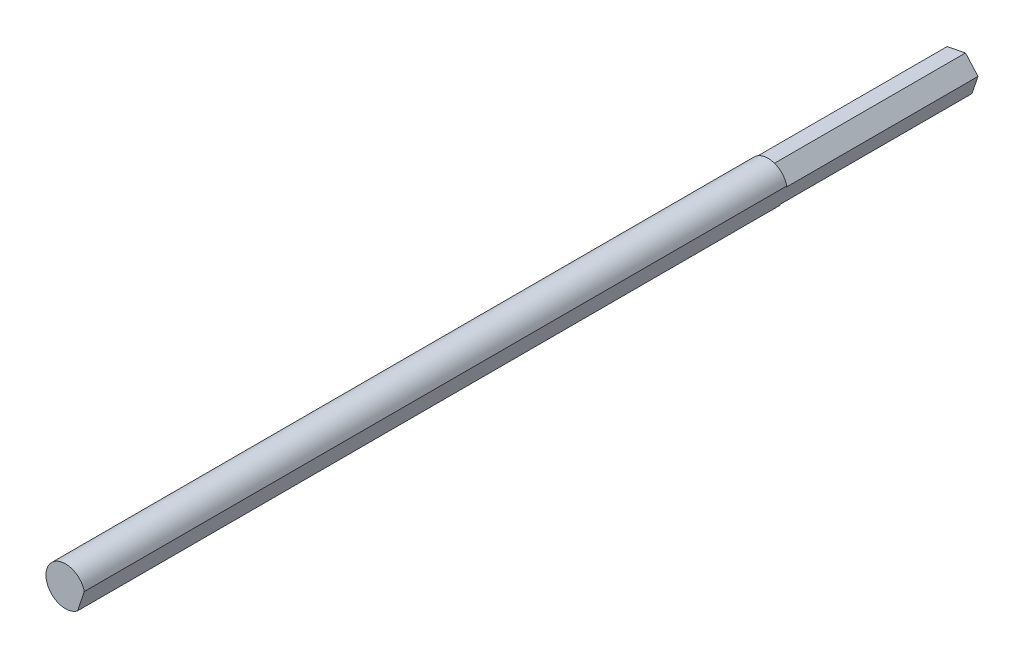
ISO-10303-21;
HEADER;
FILE_DESCRIPTION(('STEP AP214'),'2;1');
FILE_NAME('part.step','',(''),(''),'','','');
FILE_SCHEMA(('AUTOMOTIVE_DESIGN { 1 0 10303 214 1 1 1 1 }'));
ENDSEC;
DATA;
#1=APPLICATION_CONTEXT('core data for automotive mechanical design processes');
#2=APPLICATION_PROTOCOL_DEFINITION('international standard','automotive_design',2000,#1);
#3=PRODUCT_CONTEXT('',#1,'mechanical');
#4=PRODUCT('Part','Part','',(#3));
#5=PRODUCT_RELATED_PRODUCT_CATEGORY('part','',(#4));
#6=PRODUCT_DEFINITION_FORMATION('','',#4);
#7=PRODUCT_DEFINITION_CONTEXT('part definition',#1,'design');
#8=PRODUCT_DEFINITION('design','',#6,#7);
#9=PRODUCT_DEFINITION_SHAPE('','',#8);
#10=(LENGTH_UNIT() NAMED_UNIT(*) SI_UNIT(.MILLI.,.METRE.));
#11=(NAMED_UNIT(*) PLANE_ANGLE_UNIT() SI_UNIT($,.RADIAN.));
#12=(NAMED_UNIT(*) SI_UNIT($,.STERADIAN.) SOLID_ANGLE_UNIT());
#13=UNCERTAINTY_MEASURE_WITH_UNIT(LENGTH_MEASURE(1.E-05),#10,'distance_accuracy_value','');
#14=(GEOMETRIC_REPRESENTATION_CONTEXT(3) GLOBAL_UNCERTAINTY_ASSIGNED_CONTEXT((#13)) GLOBAL_UNIT_ASSIGNED_CONTEXT((#10,
#11,#12)) REPRESENTATION_CONTEXT('',''));
#15=CARTESIAN_POINT('',(0.,0.,0.));
#16=DIRECTION('',(0.,0.,1.));
#17=DIRECTION('',(1.,0.,0.));
#18=AXIS2_PLACEMENT_3D('',#15,#16,#17);
#19=CARTESIAN_POINT('',(0.,0.,-110.));
#20=DIRECTION('',(0.,0.,1.));
#21=DIRECTION('',(1.,0.,0.));
#22=AXIS2_PLACEMENT_3D('',#19,#20,#21);
#23=PLANE('',#22);
#24=DIRECTION('',(0.317894292419729,0.948126161882985,0.));
#25=VECTOR('',#24,1.);
#26=CARTESIAN_POINT('',(2.42224895944074,-0.812148372213014,-110.));
#27=LINE('',#26,#25);
#28=CARTESIAN_POINT('',(1.89263048526532,-2.39174619185322,-110.));
#29=VERTEX_POINT('',#28);
#30=CARTESIAN_POINT('',(1.95335487812164,-2.21063446099041,-110.));
#31=VERTEX_POINT('',#30);
#32=EDGE_CURVE('E99',#29,#31,#27,.T.);
#33=ORIENTED_EDGE('',*,*,#32,.F.);
#34=CARTESIAN_POINT('',(0.,0.,-110.));
#35=DIRECTION('',(0.,0.,1.));
#36=DIRECTION('',(1.,0.,0.));
#37=AXIS2_PLACEMENT_3D('',#34,#35,#36);
#38=CIRCLE('',#37,3.05);
#39=CARTESIAN_POINT('',(2.95186743361617,0.76744944742719,-110.));
#40=VERTEX_POINT('',#39);
#41=EDGE_CURVE('E11',#40,#29,#38,.T.);
#42=ORIENTED_EDGE('',*,*,#41,.F.);
#43=CARTESIAN_POINT('',(2.89114304075984,0.586337716564391,-110.));
#44=VERTEX_POINT('',#43);
#45=EDGE_CURVE('E111',#44,#40,#27,.T.);
#46=ORIENTED_EDGE('',*,*,#45,.F.);
#47=DIRECTION('',(0.662154195973439,-0.749367613895056,0.));
#48=VECTOR('',#47,1.);
#49=CARTESIAN_POINT('',(0.937788162638196,2.79697217755481,-110.));
#50=LINE('',#49,#48);
#51=CARTESIAN_POINT('',(0.937788162638196,2.79697217755481,-110.));
#52=VERTEX_POINT('',#51);
#53=EDGE_CURVE('E118',#52,#44,#50,.T.);
#54=ORIENTED_EDGE('',*,*,#53,.F.);
#55=DIRECTION('',(0.980048488393166,0.19875854798793,0.));
#56=VECTOR('',#55,1.);
#57=CARTESIAN_POINT('',(-1.95335487812164,2.21063446099041,-110.));
#58=LINE('',#57,#56);
#59=CARTESIAN_POINT('',(-1.95335487812164,2.21063446099041,-110.));
#60=VERTEX_POINT('',#59);
#61=EDGE_CURVE('E161',#60,#52,#58,.T.);
#62=ORIENTED_EDGE('',*,*,#61,.F.);
#63=DIRECTION('',(0.317894292419727,0.948126161882985,0.));
#64=VECTOR('',#63,1.);
#65=CARTESIAN_POINT('',(-2.89114304075984,-0.586337716564393,-110.));
#66=LINE('',#65,#64);
#67=CARTESIAN_POINT('',(-2.89114304075984,-0.586337716564393,-110.));
#68=VERTEX_POINT('',#67);
#69=EDGE_CURVE('E58',#68,#60,#66,.T.);
#70=ORIENTED_EDGE('',*,*,#69,.F.);
#71=DIRECTION('',(-0.662154195973439,0.749367613895055,0.));
#72=VECTOR('',#71,1.);
#73=CARTESIAN_POINT('',(-0.937788162638196,-2.79697217755481,-110.));
#74=LINE('',#73,#72);
#75=CARTESIAN_POINT('',(-0.937788162638196,-2.79697217755481,-110.));
#76=VERTEX_POINT('',#75);
#77=EDGE_CURVE('E114',#76,#68,#74,.T.);
#78=ORIENTED_EDGE('',*,*,#77,.F.);
#79=DIRECTION('',(-0.980048488393166,-0.19875854798793,0.));
#80=VECTOR('',#79,1.);
#81=CARTESIAN_POINT('',(1.95335487812164,-2.21063446099041,-110.));
#82=LINE('',#81,#80);
#83=EDGE_CURVE('E113',#31,#76,#82,.T.);
#84=ORIENTED_EDGE('',*,*,#83,.F.);
#85=EDGE_LOOP('',(#33,#42,#46,#54,#62,#70,#78,#84));
#86=FACE_BOUND('',#85,.T.);
#87=ADVANCED_FACE('F35',(#86),#23,.F.);
#88=CARTESIAN_POINT('',(0.,0.,-110.));
#89=DIRECTION('',(0.,0.,1.));
#90=DIRECTION('',(1.,0.,0.));
#91=AXIS2_PLACEMENT_3D('',#88,#89,#90);
#92=CYLINDRICAL_SURFACE('',#91,3.05);
#93=CARTESIAN_POINT('',(0.,0.,0.));
#94=DIRECTION('',(0.,0.,1.));
#95=DIRECTION('',(1.,0.,0.));
#96=AXIS2_PLACEMENT_3D('',#93,#94,#95);
#97=CIRCLE('',#96,3.05);
#98=CARTESIAN_POINT('',(2.95186743361617,0.76744944742719,0.));
#99=VERTEX_POINT('',#98);
#100=CARTESIAN_POINT('',(1.89263048526532,-2.39174619185322,0.));
#101=VERTEX_POINT('',#100);
#102=EDGE_CURVE('E39',#99,#101,#97,.T.);
#103=ORIENTED_EDGE('',*,*,#102,.F.);
#104=DIRECTION('',(0.,0.,1.));
#105=VECTOR('',#104,1.);
#106=CARTESIAN_POINT('',(2.95186743361617,0.767449447427191,-110.));
#107=LINE('',#106,#105);
#108=EDGE_CURVE('E50',#99,#40,#107,.F.);
#109=ORIENTED_EDGE('',*,*,#108,.T.);
#110=ORIENTED_EDGE('',*,*,#41,.T.);
#111=DIRECTION('',(0.,0.,1.));
#112=VECTOR('',#111,1.);
#113=CARTESIAN_POINT('',(1.89263048526532,-2.39174619185322,-110.));
#114=LINE('',#113,#112);
#115=EDGE_CURVE('E108',#29,#101,#114,.T.);
#116=ORIENTED_EDGE('',*,*,#115,.T.);
#117=EDGE_LOOP('',(#103,#109,#110,#116));
#118=FACE_BOUND('',#117,.T.);
#119=ADVANCED_FACE('F37',(#118),#92,.T.);
#120=CARTESIAN_POINT('',(0.,0.,0.));
#121=DIRECTION('',(0.,0.,1.));
#122=DIRECTION('',(1.,0.,0.));
#123=AXIS2_PLACEMENT_3D('',#120,#121,#122);
#124=PLANE('',#123);
#125=ORIENTED_EDGE('',*,*,#102,.T.);
#126=DIRECTION('',(0.317894292419729,0.948126161882985,0.));
#127=VECTOR('',#126,1.);
#128=CARTESIAN_POINT('',(2.42224895944074,-0.812148372213014,0.));
#129=LINE('',#128,#127);
#130=EDGE_CURVE('E142',#101,#99,#129,.T.);
#131=ORIENTED_EDGE('',*,*,#130,.T.);
#132=EDGE_LOOP('',(#125,#131));
#133=FACE_BOUND('',#132,.T.);
#134=ADVANCED_FACE('F141',(#133),#124,.T.);
#135=CARTESIAN_POINT('',(-2.89114304075984,-0.586337716564393,-140.));
#136=DIRECTION('',(0.948126161882985,-0.317894292419727,0.));
#137=DIRECTION('',(0.317894292419727,0.948126161882985,0.));
#138=AXIS2_PLACEMENT_3D('',#135,#136,#137);
#139=PLANE('',#138);
#140=ORIENTED_EDGE('',*,*,#69,.T.);
#141=DIRECTION('',(0.,0.,1.));
#142=VECTOR('',#141,1.);
#143=CARTESIAN_POINT('',(-1.95335487812164,2.21063446099041,-140.));
#144=LINE('',#143,#142);
#145=CARTESIAN_POINT('',(-1.95335487812164,2.21063446099041,-140.));
#146=VERTEX_POINT('',#145);
#147=EDGE_CURVE('E133',#146,#60,#144,.T.);
#148=ORIENTED_EDGE('',*,*,#147,.F.);
#149=DIRECTION('',(0.317894292419727,0.948126161882985,0.));
#150=VECTOR('',#149,1.);
#151=CARTESIAN_POINT('',(-2.89114304075984,-0.586337716564393,-140.));
#152=LINE('',#151,#150);
#153=CARTESIAN_POINT('',(-2.89114304075984,-0.586337716564393,-140.));
#154=VERTEX_POINT('',#153);
#155=EDGE_CURVE('E148',#154,#146,#152,.T.);
#156=ORIENTED_EDGE('',*,*,#155,.F.);
#157=DIRECTION('',(0.,0.,1.));
#158=VECTOR('',#157,1.);
#159=CARTESIAN_POINT('',(-2.89114304075984,-0.586337716564393,-140.));
#160=LINE('',#159,#158);
#161=EDGE_CURVE('E127',#154,#68,#160,.T.);
#162=ORIENTED_EDGE('',*,*,#161,.T.);
#163=EDGE_LOOP('',(#140,#148,#156,#162));
#164=FACE_BOUND('',#163,.T.);
#165=ADVANCED_FACE('F169',(#164),#139,.F.);
#166=CARTESIAN_POINT('',(-1.95335487812164,2.21063446099041,-140.));
#167=DIRECTION('',(0.19875854798793,-0.980048488393166,0.));
#168=DIRECTION('',(0.980048488393166,0.19875854798793,0.));
#169=AXIS2_PLACEMENT_3D('',#166,#167,#168);
#170=PLANE('',#169);
#171=ORIENTED_EDGE('',*,*,#61,.T.);
#172=DIRECTION('',(0.,0.,1.));
#173=VECTOR('',#172,1.);
#174=CARTESIAN_POINT('',(0.937788162638196,2.79697217755481,-140.));
#175=LINE('',#174,#173);
#176=CARTESIAN_POINT('',(0.937788162638196,2.79697217755481,-140.));
#177=VERTEX_POINT('',#176);
#178=EDGE_CURVE('E125',#177,#52,#175,.T.);
#179=ORIENTED_EDGE('',*,*,#178,.F.);
#180=DIRECTION('',(0.980048488393166,0.19875854798793,0.));
#181=VECTOR('',#180,1.);
#182=CARTESIAN_POINT('',(-1.95335487812164,2.21063446099041,-140.));
#183=LINE('',#182,#181);
#184=EDGE_CURVE('E151',#146,#177,#183,.T.);
#185=ORIENTED_EDGE('',*,*,#184,.F.);
#186=ORIENTED_EDGE('',*,*,#147,.T.);
#187=EDGE_LOOP('',(#171,#179,#185,#186));
#188=FACE_BOUND('',#187,.T.);
#189=ADVANCED_FACE('F180',(#188),#170,.F.);
#190=CARTESIAN_POINT('',(0.937788162638196,2.79697217755481,-140.));
#191=DIRECTION('',(-0.749367613895055,-0.662154195973438,0.));
#192=DIRECTION('',(0.662154195973439,-0.749367613895056,0.));
#193=AXIS2_PLACEMENT_3D('',#190,#191,#192);
#194=PLANE('',#193);
#195=ORIENTED_EDGE('',*,*,#53,.T.);
#196=DIRECTION('',(0.,0.,1.));
#197=VECTOR('',#196,1.);
#198=CARTESIAN_POINT('',(2.89114304075984,0.586337716564393,-140.));
#199=LINE('',#198,#197);
#200=CARTESIAN_POINT('',(2.89114304075984,0.586337716564393,-140.));
#201=VERTEX_POINT('',#200);
#202=EDGE_CURVE('E122',#201,#44,#199,.T.);
#203=ORIENTED_EDGE('',*,*,#202,.F.);
#204=DIRECTION('',(0.662154195973439,-0.749367613895056,0.));
#205=VECTOR('',#204,1.);
#206=CARTESIAN_POINT('',(0.937788162638196,2.79697217755481,-140.));
#207=LINE('',#206,#205);
#208=EDGE_CURVE('E153',#177,#201,#207,.T.);
#209=ORIENTED_EDGE('',*,*,#208,.F.);
#210=ORIENTED_EDGE('',*,*,#178,.T.);
#211=EDGE_LOOP('',(#195,#203,#209,#210));
#212=FACE_BOUND('',#211,.T.);
#213=ADVANCED_FACE('F178',(#212),#194,.F.);
#214=CARTESIAN_POINT('',(2.89114304075984,0.586337716564393,-140.));
#215=DIRECTION('',(-0.948126161882985,0.317894292419727,0.));
#216=DIRECTION('',(-0.317894292419727,-0.948126161882985,0.));
#217=AXIS2_PLACEMENT_3D('',#214,#215,#216);
#218=PLANE('',#217);
#219=ORIENTED_EDGE('',*,*,#202,.T.);
#220=ORIENTED_EDGE('',*,*,#45,.T.);
#221=ORIENTED_EDGE('',*,*,#108,.F.);
#222=ORIENTED_EDGE('',*,*,#130,.F.);
#223=ORIENTED_EDGE('',*,*,#115,.F.);
#224=ORIENTED_EDGE('',*,*,#32,.T.);
#225=DIRECTION('',(0.,0.,1.));
#226=VECTOR('',#225,1.);
#227=CARTESIAN_POINT('',(1.95335487812164,-2.21063446099041,-140.));
#228=LINE('',#227,#226);
#229=CARTESIAN_POINT('',(1.95335487812164,-2.21063446099041,-140.));
#230=VERTEX_POINT('',#229);
#231=EDGE_CURVE('E105',#230,#31,#228,.T.);
#232=ORIENTED_EDGE('',*,*,#231,.F.);
#233=DIRECTION('',(-0.317894292419727,-0.948126161882985,0.));
#234=VECTOR('',#233,1.);
#235=CARTESIAN_POINT('',(2.89114304075984,0.586337716564393,-140.));
#236=LINE('',#235,#234);
#237=EDGE_CURVE('E155',#201,#230,#236,.T.);
#238=ORIENTED_EDGE('',*,*,#237,.F.);
#239=EDGE_LOOP('',(#219,#220,#221,#222,#223,#224,#232,#238));
#240=FACE_BOUND('',#239,.T.);
#241=ADVANCED_FACE('F102',(#240),#218,.F.);
#242=CARTESIAN_POINT('',(1.95335487812164,-2.21063446099041,-140.));
#243=DIRECTION('',(-0.19875854798793,0.980048488393166,0.));
#244=DIRECTION('',(-0.980048488393166,-0.19875854798793,0.));
#245=AXIS2_PLACEMENT_3D('',#242,#243,#244);
#246=PLANE('',#245);
#247=ORIENTED_EDGE('',*,*,#83,.T.);
#248=DIRECTION('',(0.,0.,1.));
#249=VECTOR('',#248,1.);
#250=CARTESIAN_POINT('',(-0.937788162638196,-2.79697217755481,-140.));
#251=LINE('',#250,#249);
#252=CARTESIAN_POINT('',(-0.937788162638196,-2.79697217755481,-140.));
#253=VERTEX_POINT('',#252);
#254=EDGE_CURVE('E123',#253,#76,#251,.T.);
#255=ORIENTED_EDGE('',*,*,#254,.F.);
#256=DIRECTION('',(-0.980048488393166,-0.19875854798793,0.));
#257=VECTOR('',#256,1.);
#258=CARTESIAN_POINT('',(1.95335487812164,-2.21063446099041,-140.));
#259=LINE('',#258,#257);
#260=EDGE_CURVE('E121',#230,#253,#259,.T.);
#261=ORIENTED_EDGE('',*,*,#260,.F.);
#262=ORIENTED_EDGE('',*,*,#231,.T.);
#263=EDGE_LOOP('',(#247,#255,#261,#262));
#264=FACE_BOUND('',#263,.T.);
#265=ADVANCED_FACE('F120',(#264),#246,.F.);
#266=CARTESIAN_POINT('',(-0.937788162638196,-2.79697217755481,-140.));
#267=DIRECTION('',(0.749367613895056,0.662154195973439,0.));
#268=DIRECTION('',(-0.662154195973439,0.749367613895056,0.));
#269=AXIS2_PLACEMENT_3D('',#266,#267,#268);
#270=PLANE('',#269);
#271=ORIENTED_EDGE('',*,*,#77,.T.);
#272=ORIENTED_EDGE('',*,*,#161,.F.);
#273=DIRECTION('',(-0.662154195973439,0.749367613895055,0.));
#274=VECTOR('',#273,1.);
#275=CARTESIAN_POINT('',(-0.937788162638196,-2.79697217755481,-140.));
#276=LINE('',#275,#274);
#277=EDGE_CURVE('E158',#253,#154,#276,.T.);
#278=ORIENTED_EDGE('',*,*,#277,.F.);
#279=ORIENTED_EDGE('',*,*,#254,.T.);
#280=EDGE_LOOP('',(#271,#272,#278,#279));
#281=FACE_BOUND('',#280,.T.);
#282=ADVANCED_FACE('F172',(#281),#270,.F.);
#283=CARTESIAN_POINT('',(0.,0.,-140.));
#284=DIRECTION('',(0.,0.,-1.));
#285=DIRECTION('',(-1.,0.,0.));
#286=AXIS2_PLACEMENT_3D('',#283,#284,#285);
#287=PLANE('',#286);
#288=ORIENTED_EDGE('',*,*,#155,.T.);
#289=ORIENTED_EDGE('',*,*,#184,.T.);
#290=ORIENTED_EDGE('',*,*,#208,.T.);
#291=ORIENTED_EDGE('',*,*,#237,.T.);
#292=ORIENTED_EDGE('',*,*,#260,.T.);
#293=ORIENTED_EDGE('',*,*,#277,.T.);
#294=EDGE_LOOP('',(#288,#289,#290,#291,#292,#293));
#295=FACE_BOUND('',#294,.T.);
#296=ADVANCED_FACE('F174',(#295),#287,.T.);
#297=CLOSED_SHELL('',(#87,#119,#134,#165,#189,#213,#241,#265,#282,#296));
#298=MANIFOLD_SOLID_BREP('B2',#297);
#299=ADVANCED_BREP_SHAPE_REPRESENTATION('',(#18,#298),#14);
#300=SHAPE_DEFINITION_REPRESENTATION(#9,#299);
ENDSEC;
END-ISO-10303-21;
